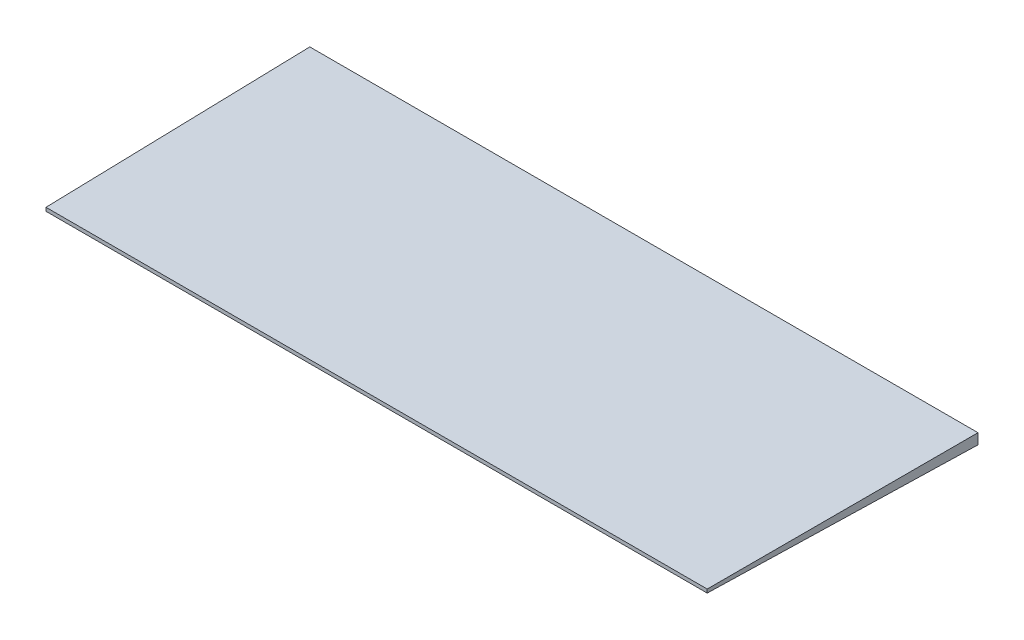
ISO-10303-21;
HEADER;
FILE_DESCRIPTION(('STEP AP214'),'2;1');
FILE_NAME('part.step','',(''),(''),'','','');
FILE_SCHEMA(('AUTOMOTIVE_DESIGN { 1 0 10303 214 1 1 1 1 }'));
ENDSEC;
DATA;
#1=APPLICATION_CONTEXT('core data for automotive mechanical design processes');
#2=APPLICATION_PROTOCOL_DEFINITION('international standard','automotive_design',2000,#1);
#3=PRODUCT_CONTEXT('',#1,'mechanical');
#4=PRODUCT('Part','Part','',(#3));
#5=PRODUCT_RELATED_PRODUCT_CATEGORY('part','',(#4));
#6=PRODUCT_DEFINITION_FORMATION('','',#4);
#7=PRODUCT_DEFINITION_CONTEXT('part definition',#1,'design');
#8=PRODUCT_DEFINITION('design','',#6,#7);
#9=PRODUCT_DEFINITION_SHAPE('','',#8);
#10=(LENGTH_UNIT() NAMED_UNIT(*) SI_UNIT(.MILLI.,.METRE.));
#11=(NAMED_UNIT(*) PLANE_ANGLE_UNIT() SI_UNIT($,.RADIAN.));
#12=(NAMED_UNIT(*) SI_UNIT($,.STERADIAN.) SOLID_ANGLE_UNIT());
#13=UNCERTAINTY_MEASURE_WITH_UNIT(LENGTH_MEASURE(1.E-05),#10,'distance_accuracy_value','');
#14=(GEOMETRIC_REPRESENTATION_CONTEXT(3) GLOBAL_UNCERTAINTY_ASSIGNED_CONTEXT((#13)) GLOBAL_UNIT_ASSIGNED_CONTEXT((#10,
#11,#12)) REPRESENTATION_CONTEXT('',''));
#15=CARTESIAN_POINT('',(0.,0.,0.));
#16=DIRECTION('',(0.,0.,1.));
#17=DIRECTION('',(1.,0.,0.));
#18=AXIS2_PLACEMENT_3D('',#15,#16,#17);
#19=CARTESIAN_POINT('',(190.5,-3.,0.));
#20=DIRECTION('',(0.999914327574007,0.,0.0130895955713445));
#21=DIRECTION('',(0.0130895955713445,0.,-0.999914327574007));
#22=AXIS2_PLACEMENT_3D('',#19,#20,#21);
#23=PLANE('',#22);
#24=DIRECTION('',(0.,1.,0.));
#25=VECTOR('',#24,1.);
#26=CARTESIAN_POINT('',(190.5,-3.,0.));
#27=LINE('',#26,#25);
#28=CARTESIAN_POINT('',(190.5,-3.,0.));
#29=VERTEX_POINT('',#28);
#30=CARTESIAN_POINT('',(190.5,3.,0.));
#31=VERTEX_POINT('',#30);
#32=EDGE_CURVE('E78',#29,#31,#27,.T.);
#33=ORIENTED_EDGE('',*,*,#32,.T.);
#34=DIRECTION('',(0.0130884743460528,0.0130884743460528,-0.999828677163536));
#35=VECTOR('',#34,1.);
#36=CARTESIAN_POINT('',(190.434731590771,2.93473159077053,4.98585438876258));
#37=LINE('',#36,#35);
#38=CARTESIAN_POINT('',(188.504974716271,1.00497471627113,152.4));
#39=VERTEX_POINT('',#38);
#40=EDGE_CURVE('E11',#39,#31,#37,.T.);
#41=ORIENTED_EDGE('',*,*,#40,.F.);
#42=DIRECTION('',(0.,-1.,0.));
#43=VECTOR('',#42,1.);
#44=CARTESIAN_POINT('',(188.504974716271,0.,152.4));
#45=LINE('',#44,#43);
#46=CARTESIAN_POINT('',(188.504974716271,-1.00497471627113,152.4));
#47=VERTEX_POINT('',#46);
#48=EDGE_CURVE('E94',#47,#39,#45,.F.);
#49=ORIENTED_EDGE('',*,*,#48,.F.);
#50=DIRECTION('',(0.0130884743460528,-0.0130884743460528,-0.999828677163536));
#51=VECTOR('',#50,1.);
#52=CARTESIAN_POINT('',(190.5,-3.,0.));
#53=LINE('',#52,#51);
#54=EDGE_CURVE('E89',#47,#29,#53,.T.);
#55=ORIENTED_EDGE('',*,*,#54,.T.);
#56=EDGE_LOOP('',(#33,#41,#49,#55));
#57=FACE_BOUND('',#56,.T.);
#58=ADVANCED_FACE('F32',(#57),#23,.T.);
#59=CARTESIAN_POINT('',(-190.5,3.,0.));
#60=DIRECTION('',(0.,0.999914327574007,0.0130895955713445));
#61=DIRECTION('',(0.,-0.0130895955713445,0.999914327574007));
#62=AXIS2_PLACEMENT_3D('',#59,#60,#61);
#63=PLANE('',#62);
#64=DIRECTION('',(-1.,0.,0.));
#65=VECTOR('',#64,1.);
#66=CARTESIAN_POINT('',(-190.5,3.,0.));
#67=LINE('',#66,#65);
#68=CARTESIAN_POINT('',(-190.5,3.,0.));
#69=VERTEX_POINT('',#68);
#70=EDGE_CURVE('E74',#31,#69,#67,.T.);
#71=ORIENTED_EDGE('',*,*,#70,.T.);
#72=DIRECTION('',(-0.0130884743460528,0.0130884743460528,-0.999828677163536));
#73=VECTOR('',#72,1.);
#74=CARTESIAN_POINT('',(-190.498972151036,2.99897215103576,0.078517391949017));
#75=LINE('',#74,#73);
#76=CARTESIAN_POINT('',(-188.504974716271,1.00497471627113,152.4));
#77=VERTEX_POINT('',#76);
#78=EDGE_CURVE('E41',#77,#69,#75,.T.);
#79=ORIENTED_EDGE('',*,*,#78,.F.);
#80=DIRECTION('',(1.,0.,0.));
#81=VECTOR('',#80,1.);
#82=CARTESIAN_POINT('',(0.,1.00497471627113,152.4));
#83=LINE('',#82,#81);
#84=EDGE_CURVE('E85',#39,#77,#83,.F.);
#85=ORIENTED_EDGE('',*,*,#84,.F.);
#86=ORIENTED_EDGE('',*,*,#40,.T.);
#87=EDGE_LOOP('',(#71,#79,#85,#86));
#88=FACE_BOUND('',#87,.T.);
#89=ADVANCED_FACE('F34',(#88),#63,.T.);
#90=CARTESIAN_POINT('',(-190.5,-3.,0.));
#91=DIRECTION('',(-0.999914327574007,0.,0.0130895955713445));
#92=DIRECTION('',(0.0130895955713445,0.,0.999914327574007));
#93=AXIS2_PLACEMENT_3D('',#90,#91,#92);
#94=PLANE('',#93);
#95=DIRECTION('',(0.,-1.,0.));
#96=VECTOR('',#95,1.);
#97=CARTESIAN_POINT('',(-190.5,-3.,0.));
#98=LINE('',#97,#96);
#99=CARTESIAN_POINT('',(-190.5,-3.,0.));
#100=VERTEX_POINT('',#99);
#101=EDGE_CURVE('E79',#69,#100,#98,.T.);
#102=ORIENTED_EDGE('',*,*,#101,.T.);
#103=DIRECTION('',(-0.0130884743460528,-0.0130884743460528,-0.999828677163536));
#104=VECTOR('',#103,1.);
#105=CARTESIAN_POINT('',(-190.5,-3.,0.));
#106=LINE('',#105,#104);
#107=CARTESIAN_POINT('',(-188.504974716271,-1.00497471627113,152.4));
#108=VERTEX_POINT('',#107);
#109=EDGE_CURVE('E97',#108,#100,#106,.T.);
#110=ORIENTED_EDGE('',*,*,#109,.F.);
#111=DIRECTION('',(0.,1.,0.));
#112=VECTOR('',#111,1.);
#113=CARTESIAN_POINT('',(-188.504974716271,0.,152.4));
#114=LINE('',#113,#112);
#115=EDGE_CURVE('E53',#77,#108,#114,.F.);
#116=ORIENTED_EDGE('',*,*,#115,.F.);
#117=ORIENTED_EDGE('',*,*,#78,.T.);
#118=EDGE_LOOP('',(#102,#110,#116,#117));
#119=FACE_BOUND('',#118,.T.);
#120=ADVANCED_FACE('F104',(#119),#94,.T.);
#121=CARTESIAN_POINT('',(-190.5,-3.,0.));
#122=DIRECTION('',(0.,-0.999914327574007,0.0130895955713445));
#123=DIRECTION('',(0.,-0.0130895955713445,-0.999914327574007));
#124=AXIS2_PLACEMENT_3D('',#121,#122,#123);
#125=PLANE('',#124);
#126=DIRECTION('',(1.,0.,0.));
#127=VECTOR('',#126,1.);
#128=CARTESIAN_POINT('',(-190.5,-3.,0.));
#129=LINE('',#128,#127);
#130=EDGE_CURVE('E93',#100,#29,#129,.T.);
#131=ORIENTED_EDGE('',*,*,#130,.T.);
#132=ORIENTED_EDGE('',*,*,#54,.F.);
#133=DIRECTION('',(-1.,0.,0.));
#134=VECTOR('',#133,1.);
#135=CARTESIAN_POINT('',(0.,-1.00497471627113,152.4));
#136=LINE('',#135,#134);
#137=EDGE_CURVE('E36',#108,#47,#136,.F.);
#138=ORIENTED_EDGE('',*,*,#137,.F.);
#139=ORIENTED_EDGE('',*,*,#109,.T.);
#140=EDGE_LOOP('',(#131,#132,#138,#139));
#141=FACE_BOUND('',#140,.T.);
#142=ADVANCED_FACE('F106',(#141),#125,.T.);
#143=CARTESIAN_POINT('',(0.,0.,152.4));
#144=DIRECTION('',(0.,0.,-1.));
#145=DIRECTION('',(-1.,0.,0.));
#146=AXIS2_PLACEMENT_3D('',#143,#144,#145);
#147=PLANE('',#146);
#148=ORIENTED_EDGE('',*,*,#48,.T.);
#149=ORIENTED_EDGE('',*,*,#84,.T.);
#150=ORIENTED_EDGE('',*,*,#115,.T.);
#151=ORIENTED_EDGE('',*,*,#137,.T.);
#152=EDGE_LOOP('',(#148,#149,#150,#151));
#153=FACE_BOUND('',#152,.T.);
#154=ADVANCED_FACE('F102',(#153),#147,.F.);
#155=CARTESIAN_POINT('',(0.,0.,0.));
#156=DIRECTION('',(0.,0.,-1.));
#157=DIRECTION('',(-1.,0.,0.));
#158=AXIS2_PLACEMENT_3D('',#155,#156,#157);
#159=PLANE('',#158);
#160=ORIENTED_EDGE('',*,*,#32,.F.);
#161=ORIENTED_EDGE('',*,*,#130,.F.);
#162=ORIENTED_EDGE('',*,*,#101,.F.);
#163=ORIENTED_EDGE('',*,*,#70,.F.);
#164=EDGE_LOOP('',(#160,#161,#162,#163));
#165=FACE_BOUND('',#164,.T.);
#166=ADVANCED_FACE('F75',(#165),#159,.T.);
#167=CLOSED_SHELL('',(#58,#89,#120,#142,#154,#166));
#168=MANIFOLD_SOLID_BREP('B2',#167);
#169=ADVANCED_BREP_SHAPE_REPRESENTATION('',(#18,#168),#14);
#170=SHAPE_DEFINITION_REPRESENTATION(#9,#169);
ENDSEC;
END-ISO-10303-21;
